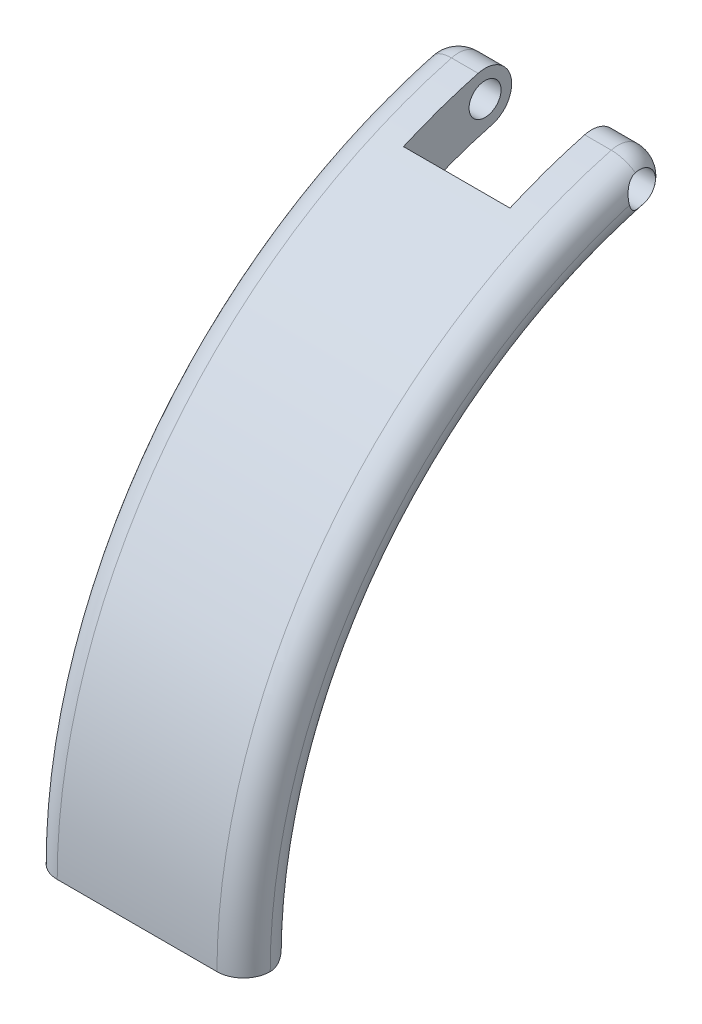
ISO-10303-21;
HEADER;
FILE_DESCRIPTION(('STEP AP214'),'2;1');
FILE_NAME('part.step','',(''),(''),'','','');
FILE_SCHEMA(('AUTOMOTIVE_DESIGN { 1 0 10303 214 1 1 1 1 }'));
ENDSEC;
DATA;
#1=APPLICATION_CONTEXT('core data for automotive mechanical design processes');
#2=APPLICATION_PROTOCOL_DEFINITION('international standard','automotive_design',2000,#1);
#3=PRODUCT_CONTEXT('',#1,'mechanical');
#4=PRODUCT('Part','Part','',(#3));
#5=PRODUCT_RELATED_PRODUCT_CATEGORY('part','',(#4));
#6=PRODUCT_DEFINITION_FORMATION('','',#4);
#7=PRODUCT_DEFINITION_CONTEXT('part definition',#1,'design');
#8=PRODUCT_DEFINITION('design','',#6,#7);
#9=PRODUCT_DEFINITION_SHAPE('','',#8);
#10=(LENGTH_UNIT() NAMED_UNIT(*) SI_UNIT(.MILLI.,.METRE.));
#11=(NAMED_UNIT(*) PLANE_ANGLE_UNIT() SI_UNIT($,.RADIAN.));
#12=(NAMED_UNIT(*) SI_UNIT($,.STERADIAN.) SOLID_ANGLE_UNIT());
#13=UNCERTAINTY_MEASURE_WITH_UNIT(LENGTH_MEASURE(1.E-05),#10,'distance_accuracy_value','');
#14=(GEOMETRIC_REPRESENTATION_CONTEXT(3) GLOBAL_UNCERTAINTY_ASSIGNED_CONTEXT((#13)) GLOBAL_UNIT_ASSIGNED_CONTEXT((#10,
#11,#12)) REPRESENTATION_CONTEXT('',''));
#15=CARTESIAN_POINT('',(0.,0.,0.));
#16=DIRECTION('',(0.,0.,1.));
#17=DIRECTION('',(1.,0.,0.));
#18=AXIS2_PLACEMENT_3D('',#15,#16,#17);
#19=CARTESIAN_POINT('',(5.,41.9292713953123,19.1555788285879));
#20=DIRECTION('',(1.,0.,0.));
#21=DIRECTION('',(0.,0.,-1.));
#22=AXIS2_PLACEMENT_3D('',#19,#20,#21);
#23=PLANE('',#22);
#24=CARTESIAN_POINT('',(5.,0.,0.));
#25=DIRECTION('',(1.,0.,0.));
#26=DIRECTION('',(0.,0.,-1.));
#27=AXIS2_PLACEMENT_3D('',#24,#25,#26);
#28=CIRCLE('',#27,45.);
#29=CARTESIAN_POINT('',(5.,43.4581821155423,11.6784591112167));
#30=VERTEX_POINT('',#29);
#31=CARTESIAN_POINT('',(5.,40.8287821211368,18.9211667321214));
#32=VERTEX_POINT('',#31);
#33=EDGE_CURVE('E147',#30,#32,#28,.T.);
#34=ORIENTED_EDGE('',*,*,#33,.F.);
#35=CARTESIAN_POINT('',(5.,45.8725255664058,12.3272623951732));
#36=DIRECTION('',(1.,0.,0.));
#37=DIRECTION('',(0.,0.,-1.));
#38=AXIS2_PLACEMENT_3D('',#35,#36,#37);
#39=CIRCLE('',#38,2.5);
#40=CARTESIAN_POINT('',(5.,46.3933588997391,9.88211768802618));
#41=VERTEX_POINT('',#40);
#42=EDGE_CURVE('E205',#30,#41,#39,.T.);
#43=ORIENTED_EDGE('',*,*,#42,.T.);
#44=CARTESIAN_POINT('',(5.,45.8725255664058,12.3272623951732));
#45=DIRECTION('',(1.,0.,0.));
#46=DIRECTION('',(0.,0.,-1.));
#47=AXIS2_PLACEMENT_3D('',#44,#45,#46);
#48=CIRCLE('',#47,2.5);
#49=CARTESIAN_POINT('',(5.,48.2868690172692,12.9760656791296));
#50=VERTEX_POINT('',#49);
#51=EDGE_CURVE('E203',#41,#50,#48,.T.);
#52=ORIENTED_EDGE('',*,*,#51,.T.);
#53=CARTESIAN_POINT('',(5.,0.,0.));
#54=DIRECTION('',(1.,0.,0.));
#55=DIRECTION('',(0.,0.,-1.));
#56=AXIS2_PLACEMENT_3D('',#53,#54,#55);
#57=CIRCLE('',#56,50.);
#58=CARTESIAN_POINT('',(5.,45.8315217048835,19.9867860901845));
#59=VERTEX_POINT('',#58);
#60=EDGE_CURVE('E173',#50,#59,#57,.T.);
#61=ORIENTED_EDGE('',*,*,#60,.T.);
#62=DIRECTION('',(0.,-0.978057882858792,-0.208333333333333));
#63=VECTOR('',#62,1.);
#64=CARTESIAN_POINT('',(5.,41.9292713953123,19.1555788285879));
#65=LINE('',#64,#63);
#66=EDGE_CURVE('E158',#59,#32,#65,.T.);
#67=ORIENTED_EDGE('',*,*,#66,.T.);
#68=EDGE_LOOP('',(#34,#43,#52,#61,#67));
#69=FACE_BOUND('',#68,.T.);
#70=CARTESIAN_POINT('',(5.,45.8727505642991,12.3264250967423));
#71=DIRECTION('',(-1.,0.,0.));
#72=DIRECTION('',(0.,0.,1.));
#73=AXIS2_PLACEMENT_3D('',#70,#71,#72);
#74=CIRCLE('',#73,1.5);
#75=CARTESIAN_POINT('',(5.,45.8727505642991,13.8264250967423));
#76=VERTEX_POINT('',#75);
#77=EDGE_CURVE('E159',#76,#76,#74,.T.);
#78=ORIENTED_EDGE('',*,*,#77,.T.);
#79=EDGE_LOOP('',(#78));
#80=FACE_BOUND('',#79,.T.);
#81=ADVANCED_FACE('F36',(#69,#80),#23,.T.);
#82=CARTESIAN_POINT('',(20.,0.,0.));
#83=DIRECTION('',(-1.,0.,0.));
#84=DIRECTION('',(0.,0.,1.));
#85=AXIS2_PLACEMENT_3D('',#82,#83,#84);
#86=CYLINDRICAL_SURFACE('',#85,45.);
#87=DIRECTION('',(-1.,0.,0.));
#88=VECTOR('',#87,1.);
#89=CARTESIAN_POINT('',(20.,43.4581821155423,11.6784591112167));
#90=LINE('',#89,#88);
#91=CARTESIAN_POINT('',(15.,43.4581821155423,11.6784591112167));
#92=VERTEX_POINT('',#91);
#93=CARTESIAN_POINT('',(17.5,43.4581821155423,11.6784591112167));
#94=VERTEX_POINT('',#93);
#95=EDGE_CURVE('E201',#92,#94,#90,.F.);
#96=ORIENTED_EDGE('',*,*,#95,.T.);
#97=CARTESIAN_POINT('',(17.5,0.,0.));
#98=DIRECTION('',(1.,0.,0.));
#99=DIRECTION('',(0.,0.,-1.));
#100=AXIS2_PLACEMENT_3D('',#97,#98,#99);
#101=CIRCLE('',#100,45.);
#102=CARTESIAN_POINT('',(17.5,2.36842105263158,44.9376299076559));
#103=VERTEX_POINT('',#102);
#104=EDGE_CURVE('E11',#94,#103,#101,.T.);
#105=ORIENTED_EDGE('',*,*,#104,.T.);
#106=DIRECTION('',(-1.,0.,0.));
#107=VECTOR('',#106,1.);
#108=CARTESIAN_POINT('',(20.,2.36842105263158,44.9376299076559));
#109=LINE('',#108,#107);
#110=CARTESIAN_POINT('',(2.5,2.36842105263158,44.9376299076559));
#111=VERTEX_POINT('',#110);
#112=EDGE_CURVE('E46',#103,#111,#109,.T.);
#113=ORIENTED_EDGE('',*,*,#112,.T.);
#114=CARTESIAN_POINT('',(2.5,0.,0.));
#115=DIRECTION('',(1.,0.,0.));
#116=DIRECTION('',(0.,0.,-1.));
#117=AXIS2_PLACEMENT_3D('',#114,#115,#116);
#118=CIRCLE('',#117,45.);
#119=CARTESIAN_POINT('',(2.5,43.4581821155423,11.6784591112167));
#120=VERTEX_POINT('',#119);
#121=EDGE_CURVE('E402',#111,#120,#118,.F.);
#122=ORIENTED_EDGE('',*,*,#121,.T.);
#123=DIRECTION('',(-1.,0.,0.));
#124=VECTOR('',#123,1.);
#125=CARTESIAN_POINT('',(20.,43.4581821155423,11.6784591112167));
#126=LINE('',#125,#124);
#127=EDGE_CURVE('E153',#120,#30,#126,.F.);
#128=ORIENTED_EDGE('',*,*,#127,.T.);
#129=ORIENTED_EDGE('',*,*,#33,.T.);
#130=DIRECTION('',(-1.,0.,0.));
#131=VECTOR('',#130,1.);
#132=CARTESIAN_POINT('',(20.,40.8287821211368,18.9211667321214));
#133=LINE('',#132,#131);
#134=CARTESIAN_POINT('',(15.,40.8287821211368,18.9211667321214));
#135=VERTEX_POINT('',#134);
#136=EDGE_CURVE('E151',#135,#32,#133,.T.);
#137=ORIENTED_EDGE('',*,*,#136,.F.);
#138=CARTESIAN_POINT('',(15.,0.,0.));
#139=DIRECTION('',(1.,0.,0.));
#140=DIRECTION('',(0.,0.,-1.));
#141=AXIS2_PLACEMENT_3D('',#138,#139,#140);
#142=CIRCLE('',#141,45.);
#143=EDGE_CURVE('E168',#92,#135,#142,.T.);
#144=ORIENTED_EDGE('',*,*,#143,.F.);
#145=EDGE_LOOP('',(#96,#105,#113,#122,#128,#129,#137,#144));
#146=FACE_BOUND('',#145,.T.);
#147=ADVANCED_FACE('F149',(#146),#86,.F.);
#148=CARTESIAN_POINT('',(20.,0.,0.));
#149=DIRECTION('',(-1.,0.,0.));
#150=DIRECTION('',(0.,0.,1.));
#151=AXIS2_PLACEMENT_3D('',#148,#149,#150);
#152=CYLINDRICAL_SURFACE('',#151,50.);
#153=DIRECTION('',(-1.,0.,0.));
#154=VECTOR('',#153,1.);
#155=CARTESIAN_POINT('',(20.,0.,50.));
#156=LINE('',#155,#154);
#157=CARTESIAN_POINT('',(17.5,0.,50.));
#158=VERTEX_POINT('',#157);
#159=CARTESIAN_POINT('',(2.5,0.,50.));
#160=VERTEX_POINT('',#159);
#161=EDGE_CURVE('E184',#158,#160,#156,.T.);
#162=ORIENTED_EDGE('',*,*,#161,.F.);
#163=CARTESIAN_POINT('',(17.5,0.,0.));
#164=DIRECTION('',(1.,0.,0.));
#165=DIRECTION('',(0.,0.,-1.));
#166=AXIS2_PLACEMENT_3D('',#163,#164,#165);
#167=CIRCLE('',#166,50.);
#168=CARTESIAN_POINT('',(17.5,48.2868690172692,12.9760656791296));
#169=VERTEX_POINT('',#168);
#170=EDGE_CURVE('E223',#158,#169,#167,.F.);
#171=ORIENTED_EDGE('',*,*,#170,.T.);
#172=DIRECTION('',(-1.,0.,0.));
#173=VECTOR('',#172,1.);
#174=CARTESIAN_POINT('',(20.,48.2868690172692,12.9760656791296));
#175=LINE('',#174,#173);
#176=CARTESIAN_POINT('',(15.,48.2868690172692,12.9760656791296));
#177=VERTEX_POINT('',#176);
#178=EDGE_CURVE('E193',#169,#177,#175,.T.);
#179=ORIENTED_EDGE('',*,*,#178,.T.);
#180=CARTESIAN_POINT('',(15.,0.,0.));
#181=DIRECTION('',(1.,0.,0.));
#182=DIRECTION('',(0.,0.,-1.));
#183=AXIS2_PLACEMENT_3D('',#180,#181,#182);
#184=CIRCLE('',#183,50.);
#185=CARTESIAN_POINT('',(15.,45.8315217048835,19.9867860901845));
#186=VERTEX_POINT('',#185);
#187=EDGE_CURVE('E182',#177,#186,#184,.T.);
#188=ORIENTED_EDGE('',*,*,#187,.T.);
#189=DIRECTION('',(-1.,0.,0.));
#190=VECTOR('',#189,1.);
#191=CARTESIAN_POINT('',(20.,45.8315217048835,19.9867860901845));
#192=LINE('',#191,#190);
#193=EDGE_CURVE('E187',#59,#186,#192,.F.);
#194=ORIENTED_EDGE('',*,*,#193,.F.);
#195=ORIENTED_EDGE('',*,*,#60,.F.);
#196=DIRECTION('',(-1.,0.,0.));
#197=VECTOR('',#196,1.);
#198=CARTESIAN_POINT('',(20.,48.2868690172692,12.9760656791296));
#199=LINE('',#198,#197);
#200=CARTESIAN_POINT('',(2.5,48.2868690172692,12.9760656791296));
#201=VERTEX_POINT('',#200);
#202=EDGE_CURVE('E190',#50,#201,#199,.T.);
#203=ORIENTED_EDGE('',*,*,#202,.T.);
#204=CARTESIAN_POINT('',(2.5,0.,0.));
#205=DIRECTION('',(1.,0.,0.));
#206=DIRECTION('',(0.,0.,-1.));
#207=AXIS2_PLACEMENT_3D('',#204,#205,#206);
#208=CIRCLE('',#207,50.);
#209=EDGE_CURVE('E221',#201,#160,#208,.T.);
#210=ORIENTED_EDGE('',*,*,#209,.T.);
#211=EDGE_LOOP('',(#162,#171,#179,#188,#194,#195,#203,#210));
#212=FACE_BOUND('',#211,.T.);
#213=ADVANCED_FACE('F342',(#212),#152,.T.);
#214=CARTESIAN_POINT('',(20.,0.,50.));
#215=DIRECTION('',(0.,1.,0.));
#216=DIRECTION('',(0.,0.,1.));
#217=AXIS2_PLACEMENT_3D('',#214,#215,#216);
#218=PLANE('',#217);
#219=CARTESIAN_POINT('',(17.5,0.,47.5));
#220=DIRECTION('',(0.,1.,0.));
#221=DIRECTION('',(0.,0.,1.));
#222=AXIS2_PLACEMENT_3D('',#219,#220,#221);
#223=CIRCLE('',#222,2.5);
#224=CARTESIAN_POINT('',(19.9991329976495,0.,47.4341649025257));
#225=VERTEX_POINT('',#224);
#226=CARTESIAN_POINT('',(20.,0.,47.5));
#227=VERTEX_POINT('',#226);
#228=EDGE_CURVE('E217',#225,#227,#223,.F.);
#229=ORIENTED_EDGE('',*,*,#228,.T.);
#230=CARTESIAN_POINT('',(17.5,0.,47.5));
#231=DIRECTION('',(0.,1.,0.));
#232=DIRECTION('',(0.,0.,1.));
#233=AXIS2_PLACEMENT_3D('',#230,#231,#232);
#234=CIRCLE('',#233,2.5);
#235=EDGE_CURVE('E219',#227,#158,#234,.F.);
#236=ORIENTED_EDGE('',*,*,#235,.T.);
#237=ORIENTED_EDGE('',*,*,#161,.T.);
#238=CARTESIAN_POINT('',(2.5,0.,47.5));
#239=DIRECTION('',(0.,1.,0.));
#240=DIRECTION('',(0.,0.,1.));
#241=AXIS2_PLACEMENT_3D('',#238,#239,#240);
#242=CIRCLE('',#241,2.5);
#243=CARTESIAN_POINT('',(0.,0.,47.5));
#244=VERTEX_POINT('',#243);
#245=EDGE_CURVE('E215',#160,#244,#242,.F.);
#246=ORIENTED_EDGE('',*,*,#245,.T.);
#247=CARTESIAN_POINT('',(2.5,0.,47.5));
#248=DIRECTION('',(0.,1.,0.));
#249=DIRECTION('',(0.,0.,1.));
#250=AXIS2_PLACEMENT_3D('',#247,#248,#249);
#251=CIRCLE('',#250,2.5);
#252=CARTESIAN_POINT('',(0.000867002350503354,0.,47.4341649025257));
#253=VERTEX_POINT('',#252);
#254=EDGE_CURVE('E207',#244,#253,#251,.F.);
#255=ORIENTED_EDGE('',*,*,#254,.T.);
#256=DIRECTION('',(-1.,0.,0.));
#257=VECTOR('',#256,1.);
#258=CARTESIAN_POINT('',(20.,0.,47.4341649025257));
#259=LINE('',#258,#257);
#260=EDGE_CURVE('E213',#253,#225,#259,.F.);
#261=ORIENTED_EDGE('',*,*,#260,.T.);
#262=EDGE_LOOP('',(#229,#236,#237,#246,#255,#261));
#263=FACE_BOUND('',#262,.T.);
#264=ADVANCED_FACE('F347',(#263),#218,.F.);
#265=CARTESIAN_POINT('',(0.,-2.08333333333333,9.78057882858791));
#266=DIRECTION('',(0.,0.208333333333333,-0.978057882858792));
#267=DIRECTION('',(0.,0.978057882858792,0.208333333333333));
#268=AXIS2_PLACEMENT_3D('',#265,#266,#267);
#269=PLANE('',#268);
#270=ORIENTED_EDGE('',*,*,#193,.T.);
#271=DIRECTION('',(0.,-0.978057882858792,-0.208333333333333));
#272=VECTOR('',#271,1.);
#273=CARTESIAN_POINT('',(15.,41.9292713953123,19.1555788285879));
#274=LINE('',#273,#272);
#275=EDGE_CURVE('E167',#186,#135,#274,.T.);
#276=ORIENTED_EDGE('',*,*,#275,.T.);
#277=ORIENTED_EDGE('',*,*,#136,.T.);
#278=ORIENTED_EDGE('',*,*,#66,.F.);
#279=EDGE_LOOP('',(#270,#276,#277,#278));
#280=FACE_BOUND('',#279,.T.);
#281=ADVANCED_FACE('F165',(#280),#269,.T.);
#282=CARTESIAN_POINT('',(15.,41.9292713953123,19.1555788285879));
#283=DIRECTION('',(1.,0.,0.));
#284=DIRECTION('',(0.,0.,-1.));
#285=AXIS2_PLACEMENT_3D('',#282,#283,#284);
#286=PLANE('',#285);
#287=CARTESIAN_POINT('',(15.,45.8727505642991,12.3264250967423));
#288=DIRECTION('',(-1.,0.,0.));
#289=DIRECTION('',(0.,0.,1.));
#290=AXIS2_PLACEMENT_3D('',#287,#288,#289);
#291=CIRCLE('',#290,1.5);
#292=CARTESIAN_POINT('',(15.,45.8727505642991,13.8264250967423));
#293=VERTEX_POINT('',#292);
#294=EDGE_CURVE('E169',#293,#293,#291,.T.);
#295=ORIENTED_EDGE('',*,*,#294,.F.);
#296=EDGE_LOOP('',(#295));
#297=FACE_BOUND('',#296,.T.);
#298=ORIENTED_EDGE('',*,*,#187,.F.);
#299=CARTESIAN_POINT('',(15.,45.8725255664058,12.3272623951732));
#300=DIRECTION('',(1.,0.,0.));
#301=DIRECTION('',(0.,0.,-1.));
#302=AXIS2_PLACEMENT_3D('',#299,#300,#301);
#303=CIRCLE('',#302,2.5);
#304=CARTESIAN_POINT('',(15.,46.3933588997391,9.88211768802618));
#305=VERTEX_POINT('',#304);
#306=EDGE_CURVE('E197',#177,#305,#303,.F.);
#307=ORIENTED_EDGE('',*,*,#306,.T.);
#308=CARTESIAN_POINT('',(15.,45.8725255664058,12.3272623951732));
#309=DIRECTION('',(1.,0.,0.));
#310=DIRECTION('',(0.,0.,-1.));
#311=AXIS2_PLACEMENT_3D('',#308,#309,#310);
#312=CIRCLE('',#311,2.5);
#313=EDGE_CURVE('E195',#305,#92,#312,.F.);
#314=ORIENTED_EDGE('',*,*,#313,.T.);
#315=ORIENTED_EDGE('',*,*,#143,.T.);
#316=ORIENTED_EDGE('',*,*,#275,.F.);
#317=EDGE_LOOP('',(#298,#307,#314,#315,#316));
#318=FACE_BOUND('',#317,.T.);
#319=ADVANCED_FACE('F249',(#297,#318),#286,.F.);
#320=CARTESIAN_POINT('',(20.001,45.8727505642991,12.3264250967423));
#321=DIRECTION('',(-1.,0.,0.));
#322=DIRECTION('',(0.,0.,1.));
#323=AXIS2_PLACEMENT_3D('',#320,#321,#322);
#324=CYLINDRICAL_SURFACE('',#323,1.5);
#325=CARTESIAN_POINT('',(19.49935035694,46.185205941447,10.8593287681764));
#326=CARTESIAN_POINT('',(19.4993493936338,46.2264827498817,10.8681199977383));
#327=CARTESIAN_POINT('',(19.4993492021619,46.2673686664628,10.8786495525167));
#328=CARTESIAN_POINT('',(19.4993503610981,46.3481068423771,10.9031129415853));
#329=CARTESIAN_POINT('',(19.4993517114321,46.3879591512435,10.9170466124071));
#330=CARTESIAN_POINT('',(19.4993580653417,46.5054626561994,10.9637946004257));
#331=CARTESIAN_POINT('',(19.4993653686237,46.581200138259,11.0015857932504));
#332=CARTESIAN_POINT('',(19.4993859098252,46.7252532403003,11.0893455716204));
#333=CARTESIAN_POINT('',(19.4993991505749,46.7935653013624,11.139319959547));
#334=CARTESIAN_POINT('',(19.4994311894941,46.9208304776906,11.2500254610628));
#335=CARTESIAN_POINT('',(19.499449986849,46.979784962848,11.3107549974057));
#336=CARTESIAN_POINT('',(19.499492605998,47.0866608606094,11.4412491414251));
#337=CARTESIAN_POINT('',(19.4995164279151,47.1345820027872,11.5110139704904));
#338=CARTESIAN_POINT('',(19.4995684222967,47.2180370491895,11.6576070852024));
#339=CARTESIAN_POINT('',(19.4995965951856,47.2535697438821,11.734436059624));
#340=CARTESIAN_POINT('',(19.49965648938,47.311233528569,11.8929701217883));
#341=CARTESIAN_POINT('',(19.4996882109277,47.3333637032409,11.9746755421484));
#342=CARTESIAN_POINT('',(19.4997543005447,47.3635871552962,12.1406390774463));
#343=CARTESIAN_POINT('',(19.4997886679931,47.3716837158511,12.224896590626));
#344=CARTESIAN_POINT('',(19.499852523146,47.3734402415033,12.3778818054195));
#345=CARTESIAN_POINT('',(19.4998817341027,47.3694986425181,12.4465922684488));
#346=CARTESIAN_POINT('',(19.4999406918449,47.3522796098555,12.5827874184328));
#347=CARTESIAN_POINT('',(19.4999704382737,47.3390081800681,12.6502728650704));
#348=CARTESIAN_POINT('',(19.5000001938576,47.3211313873031,12.7165442984668));
#349=B_SPLINE_CURVE_WITH_KNOTS('',3,(#325,#326,#327,#328,#329,#330,#331,#332,#333,#334,#335,
#336,#337,#338,#339,#340,#341,#342,#343,#344,#345,#346,#347,#348),.UNSPECIFIED.,.F.,.F.,(4,2,2,
2,2,2,2,2,2,2,2,4),(0.,0.126530076023759,0.253054077168638,0.505678920931936,0.758424315925027,
1.01113267636044,1.26384722999467,1.51658645022048,1.76934292927145,2.0220402678219,
2.22788319944891,2.43359378908585),.UNSPECIFIED.);
#350=CARTESIAN_POINT('',(19.49935035694,46.185205941447,10.8593287681764));
#351=VERTEX_POINT('',#350);
#352=CARTESIAN_POINT('',(19.5000001938576,47.3211313873031,12.7165442984668));
#353=VERTEX_POINT('',#352);
#354=EDGE_CURVE('E257',#351,#353,#349,.T.);
#355=ORIENTED_EDGE('',*,*,#354,.T.);
#356=CARTESIAN_POINT('',(19.5000001938576,47.3211313873031,12.7165442984668));
#357=CARTESIAN_POINT('',(19.5000059780242,47.3112287332248,12.7533257728187));
#358=CARTESIAN_POINT('',(19.501089338204,47.29992234124,12.7897039518504));
#359=CARTESIAN_POINT('',(19.5053087588972,47.2746366037146,12.8613605854016));
#360=CARTESIAN_POINT('',(19.5084429488599,47.2606597021481,12.8966400113989));
#361=CARTESIAN_POINT('',(19.5207010535486,47.215154977161,12.9998978567853));
#362=CARTESIAN_POINT('',(19.5326843571568,47.17987900991,13.0659341175434));
#363=CARTESIAN_POINT('',(19.5625224527295,47.1008709045788,13.1908217864053));
#364=CARTESIAN_POINT('',(19.5803582732416,47.0571662750202,13.2496955780073));
#365=CARTESIAN_POINT('',(19.6198857036813,46.9623753892477,13.3598711686711));
#366=CARTESIAN_POINT('',(19.6415856558672,46.9112732080564,13.4111561366492));
#367=CARTESIAN_POINT('',(19.6894493447894,46.7964808617001,13.5109742039205));
#368=CARTESIAN_POINT('',(19.7158393580067,46.732018784839,13.5585104848771));
#369=CARTESIAN_POINT('',(19.7684654508942,46.5963076459067,13.6428027877274));
#370=CARTESIAN_POINT('',(19.7947014503585,46.5250553320228,13.6795536097983));
#371=CARTESIAN_POINT('',(19.8474809930048,46.3688286213237,13.7448107042366));
#372=CARTESIAN_POINT('',(19.8737526421134,46.28320304572,13.7720006462676));
#373=CARTESIAN_POINT('',(19.920439768967,46.1070695898582,13.8107420007786));
#374=CARTESIAN_POINT('',(19.9408674312423,46.0165723422642,13.8223261408245));
#375=CARTESIAN_POINT('',(19.9708673692487,45.8477708837703,13.8282040456232));
#376=CARTESIAN_POINT('',(19.9816376594759,45.7697730149698,13.824918397412));
#377=CARTESIAN_POINT('',(19.9925708124687,45.6532335226581,13.8107979240044));
#378=CARTESIAN_POINT('',(19.9953452381098,45.6143362652467,13.8045231980774));
#379=CARTESIAN_POINT('',(19.9990631228207,45.5370458052204,13.7889090036888));
#380=CARTESIAN_POINT('',(20.000005323098,45.4986529671308,13.7795674333619));
#381=CARTESIAN_POINT('',(20.,45.4606707204937,13.7687115462138));
#382=B_SPLINE_CURVE_WITH_KNOTS('',3,(#356,#357,#358,#359,#360,#361,#362,#363,#364,#365,#366,
#367,#368,#369,#370,#371,#372,#373,#374,#375,#376,#377,#378,#379,#380,#381),.UNSPECIFIED.,.F.,
.F.,(4,2,2,2,2,2,2,2,2,2,2,2,4),(0.,0.114186326495628,0.228268649168263,0.454478793891325,
0.679962785133128,0.905939608748188,1.15793652259836,1.41005472890361,1.68935895648066,
1.96807652713247,2.20320814480767,2.32155384849757,2.43998083046461),.UNSPECIFIED.);
#383=CARTESIAN_POINT('',(20.,45.4606707204938,13.7687115462138));
#384=VERTEX_POINT('',#383);
#385=EDGE_CURVE('E262',#353,#384,#382,.T.);
#386=ORIENTED_EDGE('',*,*,#385,.T.);
#387=CARTESIAN_POINT('',(20.,45.4606707204938,13.7687115462138));
#388=CARTESIAN_POINT('',(20.0000078066762,45.4236454332307,13.7581402421578));
#389=CARTESIAN_POINT('',(19.9991108825217,45.3870359162294,13.7461314084336));
#390=CARTESIAN_POINT('',(19.9955596641298,45.3149381199744,13.71937788513));
#391=CARTESIAN_POINT('',(19.99290623247,45.2794492993318,13.7046345409583));
#392=CARTESIAN_POINT('',(19.9859134252343,45.2100385633165,13.6726294828424));
#393=CARTESIAN_POINT('',(19.9815834731626,45.1761090551721,13.6553821761917));
#394=CARTESIAN_POINT('',(19.9713432565247,45.1098427220384,13.6184822658577));
#395=CARTESIAN_POINT('',(19.96543286861,45.0775060215968,13.598829474498));
#396=CARTESIAN_POINT('',(19.9455408897634,44.9832908694315,13.5365935931406));
#397=CARTESIAN_POINT('',(19.9293802162087,44.9240356537586,13.4906530687377));
#398=CARTESIAN_POINT('',(19.8925971158397,44.8137310439286,13.3913230737351));
#399=CARTESIAN_POINT('',(19.8719697180711,44.762690903434,13.3379253277992));
#400=CARTESIAN_POINT('',(19.8261714575865,44.6659243989394,13.2207239708013));
#401=CARTESIAN_POINT('',(19.8007753914747,44.6208879237309,13.1564395028411));
#402=CARTESIAN_POINT('',(19.7487620327895,44.5414518112429,13.0219523146778));
#403=CARTESIAN_POINT('',(19.722142949784,44.5070683786193,12.951740783054));
#404=CARTESIAN_POINT('',(19.6667233628786,44.4457854266714,12.7971119190749));
#405=CARTESIAN_POINT('',(19.6380799332746,44.4204077807989,12.7120267275758));
#406=CARTESIAN_POINT('',(19.5862641850443,44.3849959713363,12.5373363681589));
#407=CARTESIAN_POINT('',(19.5630723579182,44.3749063709968,12.4477487541008));
#408=CARTESIAN_POINT('',(19.5306395920456,44.3716512053057,12.2875668508179));
#409=CARTESIAN_POINT('',(19.519400074078,44.3750621325695,12.2174633648902));
#410=CARTESIAN_POINT('',(19.5079092109396,44.3876742003409,12.1123934530894));
#411=CARTESIAN_POINT('',(19.5049728240423,44.3931647814099,12.0772436408079));
#412=CARTESIAN_POINT('',(19.5010199043889,44.4066598769056,12.0072843390007));
#413=CARTESIAN_POINT('',(19.500005336764,44.4146669548026,11.9724752339925));
#414=CARTESIAN_POINT('',(19.5000001819887,44.4239197302255,11.9379804877726));
#415=B_SPLINE_CURVE_WITH_KNOTS('',3,(#387,#388,#389,#390,#391,#392,#393,#394,#395,#396,#397,
#398,#399,#400,#401,#402,#403,#404,#405,#406,#407,#408,#409,#410,#411,#412,#413,#414),
.UNSPECIFIED.,.F.,.F.,(4,2,2,2,2,2,2,2,2,2,2,2,2,4),(0.,0.115467281896878,0.230877902671698,
0.345649018294493,0.460429094101107,0.689425687787682,0.918678450427434,1.16520028018197,
1.41209528107701,1.69060185226975,1.96809607941732,2.18029811025743,2.28726017073712,
2.39433154495708),.UNSPECIFIED.);
#416=CARTESIAN_POINT('',(19.5000001819887,44.4239197302255,11.9379804877726));
#417=VERTEX_POINT('',#416);
#418=EDGE_CURVE('E226',#384,#417,#415,.T.);
#419=ORIENTED_EDGE('',*,*,#418,.T.);
#420=CARTESIAN_POINT('',(19.5000001819887,44.4239197302255,11.9379804877726));
#421=CARTESIAN_POINT('',(19.4999818877341,44.4348486498216,11.897218605433));
#422=CARTESIAN_POINT('',(19.4999636014084,44.4474930877712,11.8569376014237));
#423=CARTESIAN_POINT('',(19.4999271581301,44.476127622786,11.7775850877187));
#424=CARTESIAN_POINT('',(19.4999090011712,44.4921175595266,11.7385135201667));
#425=CARTESIAN_POINT('',(19.4998549504978,44.5449222036026,11.6236031755888));
#426=CARTESIAN_POINT('',(19.4998194168895,44.5866077777222,11.5499348920407));
#427=CARTESIAN_POINT('',(19.4997503917523,44.6817541110181,11.4106442836592));
#428=CARTESIAN_POINT('',(19.4997169012204,44.7352205610526,11.3450258713187));
#429=CARTESIAN_POINT('',(19.499652915047,44.8524051404344,11.2237001312314));
#430=CARTESIAN_POINT('',(19.4996224187779,44.9161211137248,11.1679907242364));
#431=CARTESIAN_POINT('',(19.4995652870726,45.0519951249645,11.0680634594576));
#432=CARTESIAN_POINT('',(19.4995386514467,45.1241527478468,11.0238450370183));
#433=CARTESIAN_POINT('',(19.4994899859671,45.274893409934,10.9481360789142));
#434=CARTESIAN_POINT('',(19.4994679575361,45.3534784235813,10.9166494721493));
#435=CARTESIAN_POINT('',(19.4994291376545,45.5148357893848,10.8673084056711));
#436=CARTESIAN_POINT('',(19.4994123479989,45.5976095654634,10.8494586152842));
#437=CARTESIAN_POINT('',(19.4993845040052,45.7649390844198,10.8279340628495));
#438=CARTESIAN_POINT('',(19.4993734439907,45.8494929769546,10.8242452481869));
#439=CARTESIAN_POINT('',(19.499361358827,45.9759955336039,10.8293809987433));
#440=CARTESIAN_POINT('',(19.4993580785606,46.0182210206413,10.8328949387599));
#441=CARTESIAN_POINT('',(19.4993530616905,46.1021500499143,10.8434686448541));
#442=CARTESIAN_POINT('',(19.4993513223742,46.143854381406,10.8505221457473));
#443=CARTESIAN_POINT('',(19.49935035694,46.185205941447,10.8593287681764));
#444=B_SPLINE_CURVE_WITH_KNOTS('',3,(#420,#421,#422,#423,#424,#425,#426,#427,#428,#429,#430,
#431,#432,#433,#434,#435,#436,#437,#438,#439,#440,#441,#442,#443),.UNSPECIFIED.,.F.,.F.,(4,2,2,
2,2,2,2,2,2,2,2,4),(0.,0.126526951616191,0.253047841132053,0.50567902558374,0.758432514393435,
1.01113290415108,1.26382087411641,1.5165867614432,1.76943915855779,2.02204057316084,
2.14902352863055,2.27578250712219),.UNSPECIFIED.);
#445=EDGE_CURVE('E233',#417,#351,#444,.T.);
#446=ORIENTED_EDGE('',*,*,#445,.T.);
#447=EDGE_LOOP('',(#355,#386,#419,#446));
#448=FACE_BOUND('',#447,.T.);
#449=ORIENTED_EDGE('',*,*,#294,.T.);
#450=EDGE_LOOP('',(#449));
#451=FACE_BOUND('',#450,.T.);
#452=ADVANCED_FACE('F243',(#448,#451),#324,.F.);
#453=CARTESIAN_POINT('',(-0.00100000000000013,45.8727505642991,12.3264250967423));
#454=DIRECTION('',(1.,0.,0.));
#455=DIRECTION('',(0.,0.,-1.));
#456=AXIS2_PLACEMENT_3D('',#453,#454,#455);
#457=CYLINDRICAL_SURFACE('',#456,1.5);
#458=ORIENTED_EDGE('',*,*,#77,.F.);
#459=EDGE_LOOP('',(#458));
#460=FACE_BOUND('',#459,.T.);
#461=CARTESIAN_POINT('',(0.499999818011255,44.4239197302255,11.9379804877726));
#462=CARTESIAN_POINT('',(0.499995908758174,44.4141204705412,11.9745117416278));
#463=CARTESIAN_POINT('',(0.498857831938684,44.405719501544,12.011391729852));
#464=CARTESIAN_POINT('',(0.494430864296597,44.3917434632787,12.085516927936));
#465=CARTESIAN_POINT('',(0.491144234827857,44.3861654338029,12.1227617132941));
#466=CARTESIAN_POINT('',(0.478313660919641,44.3737604889844,12.2339691910044));
#467=CARTESIAN_POINT('',(0.46579429371892,44.3710804865771,12.3080942489456));
#468=CARTESIAN_POINT('',(0.434778037051715,44.376420224108,12.4542704148919));
#469=CARTESIAN_POINT('',(0.416303733474266,44.3843998880307,12.526328256357));
#470=CARTESIAN_POINT('',(0.375551758731595,44.410311034102,12.6676662708591));
#471=CARTESIAN_POINT('',(0.353264810970374,44.4282670351748,12.7369391476682));
#472=CARTESIAN_POINT('',(0.304032026309034,44.4764847193425,12.880393678489));
#473=CARTESIAN_POINT('',(0.276855325494502,44.5080297118882,12.954064731434));
#474=CARTESIAN_POINT('',(0.222998103502583,44.582509375774,13.0956306797395));
#475=CARTESIAN_POINT('',(0.196317779668907,44.6254484777022,13.163523314575));
#476=CARTESIAN_POINT('',(0.143080111033435,44.7275320103053,13.2992771413779));
#477=CARTESIAN_POINT('',(0.11684962360853,44.7879285607894,13.3663371042523));
#478=CARTESIAN_POINT('',(0.0709313605690543,44.9210752987723,13.489392795939));
#479=CARTESIAN_POINT('',(0.0512291059642771,44.9937975996266,13.5454128966506));
#480=CARTESIAN_POINT('',(0.0243387066403441,45.1313048150754,13.6322691992043));
#481=CARTESIAN_POINT('',(0.0152982867864755,45.1939428218598,13.6659300761033));
#482=CARTESIAN_POINT('',(0.00616529216500204,45.2914646349262,13.709677808189));
#483=CARTESIAN_POINT('',(0.0038587213393324,45.324655481791,13.7231622145179));
#484=CARTESIAN_POINT('',(0.000773662493191906,45.3919974889626,13.7477496301761));
#485=CARTESIAN_POINT('',(-3.97671047794416E-06,45.426149172032,13.7588513136446));
#486=CARTESIAN_POINT('',(0.,45.4606707204938,13.7687115462138));
#487=B_SPLINE_CURVE_WITH_KNOTS('',3,(#461,#462,#463,#464,#465,#466,#467,#468,#469,#470,#471,
#472,#473,#474,#475,#476,#477,#478,#479,#480,#481,#482,#483,#484,#485,#486),.UNSPECIFIED.,.F.,
.F.,(4,2,2,2,2,2,2,2,2,2,2,2,4),(0.,0.113378457332045,0.226637775430082,0.451051107413229,
0.674623106483505,0.898747026527683,1.15162785660177,1.40460716359959,1.68501018563221,
1.96478707175212,2.17885793795379,2.28644479898995,2.39409137216526),.UNSPECIFIED.);
#488=CARTESIAN_POINT('',(0.499999818011255,44.4239197302255,11.9379804877726));
#489=VERTEX_POINT('',#488);
#490=CARTESIAN_POINT('',(0.,45.4606707204938,13.7687115462138));
#491=VERTEX_POINT('',#490);
#492=EDGE_CURVE('E291',#489,#491,#487,.T.);
#493=ORIENTED_EDGE('',*,*,#492,.T.);
#494=CARTESIAN_POINT('',(0.,45.4606707204937,13.7687115462138));
#495=CARTESIAN_POINT('',(-4.42619903604343E-06,45.4978297291847,13.7793312541371));
#496=CARTESIAN_POINT('',(0.00089683619768629,45.5353801550791,13.7885025600358));
#497=CARTESIAN_POINT('',(0.00445577855857993,45.6109767348366,13.8039098767363));
#498=CARTESIAN_POINT('',(0.0071125503847797,45.6490226224235,13.8101474023497));
#499=CARTESIAN_POINT('',(0.0175906504513263,45.7630467217568,13.8243554465738));
#500=CARTESIAN_POINT('',(0.0279212273194097,45.8393900469894,13.8279569042415));
#501=CARTESIAN_POINT('',(0.0542638230992477,45.9905494057298,13.8237047429558));
#502=CARTESIAN_POINT('',(0.0702666718995048,46.0653676994383,13.8158695497551));
#503=CARTESIAN_POINT('',(0.106598932029727,46.2120502930728,13.7894481641989));
#504=CARTESIAN_POINT('',(0.126933358026318,46.2839110530113,13.7708494677207));
#505=CARTESIAN_POINT('',(0.172020345457934,46.428654146975,13.7218631994755));
#506=CARTESIAN_POINT('',(0.196991033672414,46.5012005387977,13.6906884460845));
#507=CARTESIAN_POINT('',(0.248105443711885,46.6402958945585,13.6175707787028));
#508=CARTESIAN_POINT('',(0.274250638614604,46.7068369931785,13.5756140119912));
#509=CARTESIAN_POINT('',(0.328526816969638,46.8403639370976,13.4759790596509));
#510=CARTESIAN_POINT('',(0.356522890405691,46.9064568717664,13.417022856728));
#511=CARTESIAN_POINT('',(0.407577570184192,47.027967928837,13.2873178737708));
#512=CARTESIAN_POINT('',(0.430651179584336,47.0834184346382,13.2166061304061));
#513=CARTESIAN_POINT('',(0.45730392911174,47.1531733235102,13.108717403762));
#514=CARTESIAN_POINT('',(0.464448728990229,47.1727554550032,13.0757380778593));
#515=CARTESIAN_POINT('',(0.47694009055163,47.2094573712381,13.0081087700964));
#516=CARTESIAN_POINT('',(0.482287247100154,47.2265779694608,12.9734593452439));
#517=CARTESIAN_POINT('',(0.490993671377385,47.2582937909907,12.9024397483391));
#518=CARTESIAN_POINT('',(0.494336554678652,47.2728675277418,12.8660579497957));
#519=CARTESIAN_POINT('',(0.498840860594331,47.2991765127525,12.7921057202011));
#520=CARTESIAN_POINT('',(0.499999792797549,47.3109085072425,12.754533981794));
#521=CARTESIAN_POINT('',(0.499999806142413,47.3211313873031,12.7165442984668));
#522=B_SPLINE_CURVE_WITH_KNOTS('',3,(#494,#495,#496,#497,#498,#499,#500,#501,#502,#503,#504,
#505,#506,#507,#508,#509,#510,#511,#512,#513,#514,#515,#516,#517,#518,#519,#520,#521),
.UNSPECIFIED.,.F.,.F.,(4,2,2,2,2,2,2,2,2,2,2,2,2,4),(0.,0.115859477416863,0.231659066745047,
0.461787004325877,0.691544588471227,0.921569622766468,1.16904200133409,1.41683393583695,
1.69417015570167,1.97064861535233,2.0875689605515,2.20445057698264,2.32227508610047,
2.44023387218575),.UNSPECIFIED.);
#523=CARTESIAN_POINT('',(0.499999806142415,47.3211313873031,12.7165442984668));
#524=VERTEX_POINT('',#523);
#525=EDGE_CURVE('E315',#491,#524,#522,.T.);
#526=ORIENTED_EDGE('',*,*,#525,.T.);
#527=CARTESIAN_POINT('',(0.499999806142415,47.3211313873031,12.7165442984668));
#528=CARTESIAN_POINT('',(0.500018100852944,47.3321071519966,12.6757939152435));
#529=CARTESIAN_POINT('',(0.500036387648743,47.3413573504848,12.634599691886));
#530=CARTESIAN_POINT('',(0.500072831883874,47.3563563110131,12.5515807561427));
#531=CARTESIAN_POINT('',(0.500090989329374,47.3621052411394,12.5097560741223));
#532=CARTESIAN_POINT('',(0.500145039684094,47.37401272643,12.3838566512353));
#533=CARTESIAN_POINT('',(0.500180572546994,47.3748689966061,12.2992185421382));
#534=CARTESIAN_POINT('',(0.500249596165352,47.3623601117063,12.1310025731476));
#535=CARTESIAN_POINT('',(0.500283085938232,47.3489881700241,12.0474252384746));
#536=CARTESIAN_POINT('',(0.500347072940099,47.3084052218578,11.8837023985906));
#537=CARTESIAN_POINT('',(0.500377570606865,47.2811962435057,11.8035563923066));
#538=CARTESIAN_POINT('',(0.500434707096207,47.2137093128113,11.6489708059273));
#539=CARTESIAN_POINT('',(0.500461345824495,47.1734310412144,11.5745313652862));
#540=CARTESIAN_POINT('',(0.500510011298152,47.0809438797244,11.4334625141157));
#541=CARTESIAN_POINT('',(0.50053203759311,47.0287338257137,11.3668338666023));
#542=CARTESIAN_POINT('',(0.500570849298182,46.9138682961902,11.2432859909244));
#543=CARTESIAN_POINT('',(0.500587634351225,46.8512121094545,11.1863674244032));
#544=CARTESIAN_POINT('',(0.50061548339186,46.7172333052939,11.0838635944866));
#545=CARTESIAN_POINT('',(0.500626548717176,46.645912719112,11.0382756823876));
#546=CARTESIAN_POINT('',(0.500641150613787,46.5105207041759,10.9670257653371));
#547=CARTESIAN_POINT('',(0.5006457027266,46.4475571358522,10.9392364442456));
#548=CARTESIAN_POINT('',(0.500650736839305,46.3184686645201,10.8925271906224));
#549=CARTESIAN_POINT('',(0.500651221454103,46.2523458200476,10.8736015672025));
#550=CARTESIAN_POINT('',(0.500649643059959,46.185205941447,10.8593287681764));
#551=B_SPLINE_CURVE_WITH_KNOTS('',3,(#527,#528,#529,#530,#531,#532,#533,#534,#535,#536,#537,
#538,#539,#540,#541,#542,#543,#544,#545,#546,#547,#548,#549,#550),.UNSPECIFIED.,.F.,.F.,(4,2,2,
2,2,2,2,2,2,2,2,4),(0.,0.126530106060487,0.253054137282074,0.50567904236117,0.758424499106993,
1.01113292093993,1.26384751636011,1.51658677827282,1.7693432549224,2.02204059041365,
2.22788336062309,2.43359378882234),.UNSPECIFIED.);
#552=CARTESIAN_POINT('',(0.500649643059959,46.185205941447,10.8593287681764));
#553=VERTEX_POINT('',#552);
#554=EDGE_CURVE('E311',#524,#553,#551,.T.);
#555=ORIENTED_EDGE('',*,*,#554,.T.);
#556=CARTESIAN_POINT('',(0.500649643059959,46.185205941447,10.8593287681764));
#557=CARTESIAN_POINT('',(0.500648679208937,46.1439300445662,10.8505383067495));
#558=CARTESIAN_POINT('',(0.50064694448643,46.1023028241645,10.8434945042378));
#559=CARTESIAN_POINT('',(0.500641947034563,46.0186052127674,10.832936758216));
#560=CARTESIAN_POINT('',(0.500638684378416,45.9765348431009,10.8294226455997));
#561=CARTESIAN_POINT('',(0.500626637906923,45.8501790208311,10.8242342527646));
#562=CARTESIAN_POINT('',(0.500615592364125,45.7656132374512,10.8278851752201));
#563=CARTESIAN_POINT('',(0.500587782120463,45.5982970743624,10.8493325712335));
#564=CARTESIAN_POINT('',(0.500571014653427,45.5155475933468,10.8671358920817));
#565=CARTESIAN_POINT('',(0.500532239101761,45.3542178107086,10.9163786739574));
#566=CARTESIAN_POINT('',(0.500510232118823,45.2756366368738,10.947815269509));
#567=CARTESIAN_POINT('',(0.50046160313137,45.1248737043811,11.0234309670539));
#568=CARTESIAN_POINT('',(0.500434981353319,45.0526916319583,11.0676094438266));
#569=CARTESIAN_POINT('',(0.500377867456931,44.9167447116906,11.1674744501416));
#570=CARTESIAN_POINT('',(0.500347374147687,44.8529824661966,11.2231645240413));
#571=CARTESIAN_POINT('',(0.500283385211844,44.7356978256888,11.3444701213147));
#572=CARTESIAN_POINT('',(0.500249888560731,44.682178944602,11.4100890369477));
#573=CARTESIAN_POINT('',(0.500180864652896,44.5869578152886,11.5493564382233));
#574=CARTESIAN_POINT('',(0.50014533944476,44.5452438905778,11.6229968890465));
#575=CARTESIAN_POINT('',(0.500091231405597,44.4923256406776,11.7380140253295));
#576=CARTESIAN_POINT('',(0.500073008747153,44.4762650336613,11.777223719429));
#577=CARTESIAN_POINT('',(0.500036465922879,44.4475395087768,11.8567896923412));
#578=CARTESIAN_POINT('',(0.500018145985729,44.4348686514381,11.8971438267815));
#579=CARTESIAN_POINT('',(0.499999818011249,44.4239197302255,11.9379804877726));
#580=B_SPLINE_CURVE_WITH_KNOTS('',3,(#556,#557,#558,#559,#560,#561,#562,#563,#564,#565,#566,
#567,#568,#569,#570,#571,#572,#573,#574,#575,#576,#577,#578,#579),.UNSPECIFIED.,.F.,.F.,(4,2,2,
2,2,2,2,2,2,2,2,4),(0.,0.126526923412641,0.253047784673289,0.505678911297366,0.758432341733022,
1.01113267354509,1.26382060792622,1.51658645972935,1.7694388665982,2.02204029164713,
2.14902338832682,2.27578250772253),.UNSPECIFIED.);
#581=EDGE_CURVE('E297',#553,#489,#580,.T.);
#582=ORIENTED_EDGE('',*,*,#581,.T.);
#583=EDGE_LOOP('',(#493,#526,#555,#582));
#584=FACE_BOUND('',#583,.T.);
#585=ADVANCED_FACE('F248',(#460,#584),#457,.F.);
#586=CARTESIAN_POINT('',(20.,45.8725255664058,12.3272623951732));
#587=DIRECTION('',(-1.,0.,0.));
#588=DIRECTION('',(0.,0.,1.));
#589=AXIS2_PLACEMENT_3D('',#586,#587,#588);
#590=CYLINDRICAL_SURFACE('',#589,2.5);
#591=DIRECTION('',(-1.,0.,0.));
#592=VECTOR('',#591,1.);
#593=CARTESIAN_POINT('',(0.,46.3933588997391,9.88211768802618));
#594=LINE('',#593,#592);
#595=CARTESIAN_POINT('',(17.5,46.3933588997391,9.88211768802618));
#596=VERTEX_POINT('',#595);
#597=EDGE_CURVE('E208',#596,#305,#594,.T.);
#598=ORIENTED_EDGE('',*,*,#597,.F.);
#599=CARTESIAN_POINT('',(17.5,45.8725255664058,12.3272623951732));
#600=DIRECTION('',(-1.,0.,0.));
#601=DIRECTION('',(0.,0.,1.));
#602=AXIS2_PLACEMENT_3D('',#599,#600,#601);
#603=CIRCLE('',#602,2.5);
#604=EDGE_CURVE('E298',#596,#94,#603,.T.);
#605=ORIENTED_EDGE('',*,*,#604,.T.);
#606=ORIENTED_EDGE('',*,*,#95,.F.);
#607=ORIENTED_EDGE('',*,*,#313,.F.);
#608=EDGE_LOOP('',(#598,#605,#606,#607));
#609=FACE_BOUND('',#608,.T.);
#610=ADVANCED_FACE('F305',(#609),#590,.T.);
#611=CARTESIAN_POINT('',(20.,45.8725255664058,12.3272623951732));
#612=DIRECTION('',(-1.,0.,0.));
#613=DIRECTION('',(0.,0.,1.));
#614=AXIS2_PLACEMENT_3D('',#611,#612,#613);
#615=CYLINDRICAL_SURFACE('',#614,2.5);
#616=ORIENTED_EDGE('',*,*,#178,.F.);
#617=CARTESIAN_POINT('',(17.5,45.8725255664058,12.3272623951732));
#618=DIRECTION('',(-1.,0.,0.));
#619=DIRECTION('',(0.,0.,1.));
#620=AXIS2_PLACEMENT_3D('',#617,#618,#619);
#621=CIRCLE('',#620,2.5);
#622=EDGE_CURVE('E385',#169,#596,#621,.T.);
#623=ORIENTED_EDGE('',*,*,#622,.T.);
#624=ORIENTED_EDGE('',*,*,#597,.T.);
#625=ORIENTED_EDGE('',*,*,#306,.F.);
#626=EDGE_LOOP('',(#616,#623,#624,#625));
#627=FACE_BOUND('',#626,.T.);
#628=ADVANCED_FACE('F352',(#627),#615,.T.);
#629=CARTESIAN_POINT('',(20.,45.8725255664058,12.3272623951732));
#630=DIRECTION('',(-1.,0.,0.));
#631=DIRECTION('',(0.,0.,1.));
#632=AXIS2_PLACEMENT_3D('',#629,#630,#631);
#633=CYLINDRICAL_SURFACE('',#632,2.5);
#634=DIRECTION('',(-1.,0.,0.));
#635=VECTOR('',#634,1.);
#636=CARTESIAN_POINT('',(0.,46.3933588997391,9.88211768802618));
#637=LINE('',#636,#635);
#638=CARTESIAN_POINT('',(2.5,46.3933588997391,9.88211768802618));
#639=VERTEX_POINT('',#638);
#640=EDGE_CURVE('E210',#639,#41,#637,.F.);
#641=ORIENTED_EDGE('',*,*,#640,.F.);
#642=CARTESIAN_POINT('',(2.5,45.8725255664058,12.3272623951732));
#643=DIRECTION('',(-1.,0.,0.));
#644=DIRECTION('',(0.,0.,1.));
#645=AXIS2_PLACEMENT_3D('',#642,#643,#644);
#646=CIRCLE('',#645,2.5);
#647=EDGE_CURVE('E321',#639,#201,#646,.F.);
#648=ORIENTED_EDGE('',*,*,#647,.T.);
#649=ORIENTED_EDGE('',*,*,#202,.F.);
#650=ORIENTED_EDGE('',*,*,#51,.F.);
#651=EDGE_LOOP('',(#641,#648,#649,#650));
#652=FACE_BOUND('',#651,.T.);
#653=ADVANCED_FACE('F355',(#652),#633,.T.);
#654=CARTESIAN_POINT('',(20.,45.8725255664058,12.3272623951732));
#655=DIRECTION('',(-1.,0.,0.));
#656=DIRECTION('',(0.,0.,1.));
#657=AXIS2_PLACEMENT_3D('',#654,#655,#656);
#658=CYLINDRICAL_SURFACE('',#657,2.5);
#659=ORIENTED_EDGE('',*,*,#127,.F.);
#660=CARTESIAN_POINT('',(2.5,45.8725255664058,12.3272623951732));
#661=DIRECTION('',(-1.,0.,0.));
#662=DIRECTION('',(0.,0.,1.));
#663=AXIS2_PLACEMENT_3D('',#660,#661,#662);
#664=CIRCLE('',#663,2.5);
#665=EDGE_CURVE('E401',#120,#639,#664,.F.);
#666=ORIENTED_EDGE('',*,*,#665,.T.);
#667=ORIENTED_EDGE('',*,*,#640,.T.);
#668=ORIENTED_EDGE('',*,*,#42,.F.);
#669=EDGE_LOOP('',(#659,#666,#667,#668));
#670=FACE_BOUND('',#669,.T.);
#671=ADVANCED_FACE('F333',(#670),#658,.T.);
#672=CARTESIAN_POINT('',(2.5,45.8725255664058,12.3272623951732));
#673=DIRECTION('',(0.,0.,1.));
#674=DIRECTION('',(1.,0.,0.));
#675=AXIS2_PLACEMENT_3D('',#672,#673,#674);
#676=SPHERICAL_SURFACE('',#675,2.5);
#677=CARTESIAN_POINT('',(2.5,45.8725255664058,12.3272623951732));
#678=DIRECTION('',(0.,-0.259521313582593,0.965737380345384));
#679=DIRECTION('',(0.,-0.965737380345384,-0.259521313582593));
#680=AXIS2_PLACEMENT_3D('',#677,#678,#679);
#681=CIRCLE('',#680,2.5);
#682=EDGE_CURVE('E426',#201,#524,#681,.T.);
#683=ORIENTED_EDGE('',*,*,#682,.F.);
#684=ORIENTED_EDGE('',*,*,#647,.F.);
#685=CARTESIAN_POINT('',(2.5,45.8725255664058,12.3272623951732));
#686=DIRECTION('',(0.,-0.978057882858792,-0.208333333333333));
#687=DIRECTION('',(0.,0.208333333333333,-0.978057882858792));
#688=AXIS2_PLACEMENT_3D('',#685,#686,#687);
#689=CIRCLE('',#688,2.5);
#690=EDGE_CURVE('E41',#553,#639,#689,.T.);
#691=ORIENTED_EDGE('',*,*,#690,.F.);
#692=ORIENTED_EDGE('',*,*,#554,.F.);
#693=EDGE_LOOP('',(#683,#684,#691,#692));
#694=FACE_BOUND('',#693,.T.);
#695=ADVANCED_FACE('F38',(#694),#676,.T.);
#696=CARTESIAN_POINT('',(2.5,45.8725255664058,12.3272623951732));
#697=DIRECTION('',(0.,0.,1.));
#698=DIRECTION('',(1.,0.,0.));
#699=AXIS2_PLACEMENT_3D('',#696,#697,#698);
#700=SPHERICAL_SURFACE('',#699,2.5);
#701=ORIENTED_EDGE('',*,*,#690,.T.);
#702=ORIENTED_EDGE('',*,*,#665,.F.);
#703=CARTESIAN_POINT('',(2.5,45.8725255664058,12.3272623951732));
#704=DIRECTION('',(0.,-0.259521313582593,0.965737380345384));
#705=DIRECTION('',(0.,-0.965737380345384,-0.259521313582593));
#706=AXIS2_PLACEMENT_3D('',#703,#704,#705);
#707=CIRCLE('',#706,2.5);
#708=EDGE_CURVE('E421',#489,#120,#707,.T.);
#709=ORIENTED_EDGE('',*,*,#708,.F.);
#710=ORIENTED_EDGE('',*,*,#581,.F.);
#711=EDGE_LOOP('',(#701,#702,#709,#710));
#712=FACE_BOUND('',#711,.T.);
#713=ADVANCED_FACE('F325',(#712),#700,.T.);
#714=CARTESIAN_POINT('',(2.5,0.,0.));
#715=DIRECTION('',(1.,0.,0.));
#716=DIRECTION('',(0.,0.,-1.));
#717=AXIS2_PLACEMENT_3D('',#714,#715,#716);
#718=TOROIDAL_SURFACE('',#717,47.5,2.5);
#719=ORIENTED_EDGE('',*,*,#682,.T.);
#720=ORIENTED_EDGE('',*,*,#525,.F.);
#721=CARTESIAN_POINT('',(0.,0.,0.));
#722=DIRECTION('',(1.,0.,0.));
#723=DIRECTION('',(0.,0.,-1.));
#724=AXIS2_PLACEMENT_3D('',#721,#722,#723);
#725=CIRCLE('',#724,47.5);
#726=EDGE_CURVE('E416',#244,#491,#725,.F.);
#727=ORIENTED_EDGE('',*,*,#726,.F.);
#728=ORIENTED_EDGE('',*,*,#245,.F.);
#729=ORIENTED_EDGE('',*,*,#209,.F.);
#730=EDGE_LOOP('',(#719,#720,#727,#728,#729));
#731=FACE_BOUND('',#730,.T.);
#732=ADVANCED_FACE('F278',(#731),#718,.T.);
#733=CARTESIAN_POINT('',(2.5,0.,0.));
#734=DIRECTION('',(1.,0.,0.));
#735=DIRECTION('',(0.,0.,-1.));
#736=AXIS2_PLACEMENT_3D('',#733,#734,#735);
#737=TOROIDAL_SURFACE('',#736,47.5,2.5);
#738=ORIENTED_EDGE('',*,*,#708,.T.);
#739=ORIENTED_EDGE('',*,*,#121,.F.);
#740=CARTESIAN_POINT('',(0.000867002350504511,0.,47.4341649025257));
#741=CARTESIAN_POINT('',(0.00234342357035546,-1.42259376936855E-05,47.3775697681255));
#742=CARTESIAN_POINT('',(0.00577034726788518,0.00192128137508478,47.321038665841));
#743=CARTESIAN_POINT('',(0.0163992675955811,0.00956058760245627,47.2086366078426));
#744=CARTESIAN_POINT('',(0.0235980198820665,0.0152611490966161,47.1527651269209));
#745=CARTESIAN_POINT('',(0.0415678150959126,0.0302333134905299,47.0426047640163));
#746=CARTESIAN_POINT('',(0.0523067056931644,0.039472892260893,46.9883062562447));
#747=CARTESIAN_POINT('',(0.0771619562491983,0.0613103959117186,46.8811864188849));
#748=CARTESIAN_POINT('',(0.0912788682004186,0.0739088696976982,46.8283653322949));
#749=CARTESIAN_POINT('',(0.138240883198054,0.11629034449421,46.6729820731606));
#750=CARTESIAN_POINT('',(0.175774666928109,0.15072459418602,46.5730426631415));
#751=CARTESIAN_POINT('',(0.261204755542542,0.229841949310456,46.3819563294755));
#752=CARTESIAN_POINT('',(0.309125355207941,0.27454909806752,46.2908307566349));
#753=CARTESIAN_POINT('',(0.435971357934155,0.393431050426387,46.0804059313904));
#754=CARTESIAN_POINT('',(0.519293323724868,0.471944491098867,45.9662025570913));
#755=CARTESIAN_POINT('',(0.697831904189443,0.640715965985554,45.7575141457399));
#756=CARTESIAN_POINT('',(0.793073418972822,0.730998603152575,45.6630715262589));
#757=CARTESIAN_POINT('',(1.03244038103003,0.958376261066312,45.4579281190647));
#758=CARTESIAN_POINT('',(1.18060383056103,1.09949314787152,45.3564253688239));
#759=CARTESIAN_POINT('',(1.48613592174828,1.39128179958842,45.1871166189954));
#760=CARTESIAN_POINT('',(1.64351077016446,1.54196001293293,45.1193336392841));
#761=CARTESIAN_POINT('',(1.91666818480643,1.80436788591727,45.0301417801357));
#762=CARTESIAN_POINT('',(2.03131294772495,1.91475535923852,45.0009900738857));
#763=CARTESIAN_POINT('',(2.26160650834531,2.13713832850789,44.9580531766248));
#764=CARTESIAN_POINT('',(2.37725317366242,2.2491306379914,44.9442409207394));
#765=CARTESIAN_POINT('',(2.49522270652457,2.36377779224122,44.937877880495));
#766=CARTESIAN_POINT('',(2.49761137026595,2.36609935372716,44.9377522759717));
#767=CARTESIAN_POINT('',(2.5,2.36842105263158,44.9376299076559));
#768=B_SPLINE_CURVE_WITH_KNOTS('',3,(#740,#741,#742,#743,#744,#745,#746,#747,#748,#749,#750,
#751,#752,#753,#754,#755,#756,#757,#758,#759,#760,#761,#762,#763,#764,#765,#766,#767),
.UNSPECIFIED.,.F.,.F.,(4,2,2,2,2,2,2,2,2,2,2,2,2,4),(0.,0.16975666842841,0.339367559547577,
0.507478598461318,0.67561712668253,1.01050811187125,1.34619102721724,1.82860400012878,
2.31204211028032,2.99359565069558,3.67561383902863,4.1603373631772,4.64420427726438,
4.65420428199778),.UNSPECIFIED.);
#769=EDGE_CURVE('E284',#253,#111,#768,.T.);
#770=ORIENTED_EDGE('',*,*,#769,.F.);
#771=ORIENTED_EDGE('',*,*,#254,.F.);
#772=ORIENTED_EDGE('',*,*,#726,.T.);
#773=ORIENTED_EDGE('',*,*,#492,.F.);
#774=EDGE_LOOP('',(#738,#739,#770,#771,#772,#773));
#775=FACE_BOUND('',#774,.T.);
#776=ADVANCED_FACE('F274',(#775),#737,.T.);
#777=CARTESIAN_POINT('',(17.5,45.8725255664058,12.3272623951732));
#778=DIRECTION('',(0.,0.,1.));
#779=DIRECTION('',(1.,0.,0.));
#780=AXIS2_PLACEMENT_3D('',#777,#778,#779);
#781=SPHERICAL_SURFACE('',#780,2.5);
#782=CARTESIAN_POINT('',(17.5,45.8725255664058,12.3272623951732));
#783=DIRECTION('',(0.,-0.259521313582592,0.965737380345384));
#784=DIRECTION('',(0.,-0.965737380345385,-0.259521313582592));
#785=AXIS2_PLACEMENT_3D('',#782,#783,#784);
#786=CIRCLE('',#785,2.5);
#787=EDGE_CURVE('E413',#94,#417,#786,.T.);
#788=ORIENTED_EDGE('',*,*,#787,.F.);
#789=ORIENTED_EDGE('',*,*,#604,.F.);
#790=CARTESIAN_POINT('',(17.5,45.8725255664058,12.3272623951732));
#791=DIRECTION('',(0.,0.978057882858792,0.208333333333333));
#792=DIRECTION('',(0.,-0.208333333333333,0.978057882858792));
#793=AXIS2_PLACEMENT_3D('',#790,#791,#792);
#794=CIRCLE('',#793,2.5);
#795=EDGE_CURVE('E387',#351,#596,#794,.T.);
#796=ORIENTED_EDGE('',*,*,#795,.F.);
#797=ORIENTED_EDGE('',*,*,#445,.F.);
#798=EDGE_LOOP('',(#788,#789,#796,#797));
#799=FACE_BOUND('',#798,.T.);
#800=ADVANCED_FACE('F277',(#799),#781,.T.);
#801=CARTESIAN_POINT('',(20.,2.5,47.4341649025257));
#802=DIRECTION('',(-1.,0.,0.));
#803=DIRECTION('',(0.,0.,1.));
#804=AXIS2_PLACEMENT_3D('',#801,#802,#803);
#805=CYLINDRICAL_SURFACE('',#804,2.5);
#806=ORIENTED_EDGE('',*,*,#769,.T.);
#807=ORIENTED_EDGE('',*,*,#112,.F.);
#808=CARTESIAN_POINT('',(19.9991329976495,0.,47.4341649025257));
#809=CARTESIAN_POINT('',(19.9976565764296,-1.42259376935316E-05,47.3775697681255));
#810=CARTESIAN_POINT('',(19.9942296527321,0.00192128137508503,47.321038665841));
#811=CARTESIAN_POINT('',(19.9836007324044,0.00956058760245659,47.2086366078426));
#812=CARTESIAN_POINT('',(19.9764019801179,0.0152611490966164,47.1527651269209));
#813=CARTESIAN_POINT('',(19.9584321849041,0.0302333134905301,47.0426047640163));
#814=CARTESIAN_POINT('',(19.9476932943068,0.0394728922608931,46.9883062562447));
#815=CARTESIAN_POINT('',(19.9228380437508,0.0613103959117186,46.8811864188849));
#816=CARTESIAN_POINT('',(19.9087211317996,0.0739088696976981,46.8283653322949));
#817=CARTESIAN_POINT('',(19.8617591168019,0.11629034449421,46.6729820731606));
#818=CARTESIAN_POINT('',(19.8242253330719,0.150724594186022,46.5730426631415));
#819=CARTESIAN_POINT('',(19.7387952444575,0.229841949310458,46.3819563294755));
#820=CARTESIAN_POINT('',(19.6908746447921,0.27454909806752,46.2908307566349));
#821=CARTESIAN_POINT('',(19.5640286420659,0.393431050426388,46.0804059313904));
#822=CARTESIAN_POINT('',(19.4807066762751,0.471944491098875,45.9662025570913));
#823=CARTESIAN_POINT('',(19.3021680958106,0.640715965985538,45.7575141457399));
#824=CARTESIAN_POINT('',(19.2069265810271,0.730998603152528,45.6630715262589));
#825=CARTESIAN_POINT('',(18.96755961897,0.958376261066375,45.4579281190647));
#826=CARTESIAN_POINT('',(18.8193961694392,1.0994931478718,45.3564253688239));
#827=CARTESIAN_POINT('',(18.5138640782514,1.39128179958815,45.1871166189954));
#828=CARTESIAN_POINT('',(18.3564892298345,1.5419600129319,45.1193336392841));
#829=CARTESIAN_POINT('',(18.0833318151943,1.80436788591799,45.0301417801356));
#830=CARTESIAN_POINT('',(17.9686870522773,1.91475535924087,45.0009900738856));
#831=CARTESIAN_POINT('',(17.7383934916524,2.1371383285055,44.958053176625));
#832=CARTESIAN_POINT('',(17.6227468263291,2.24913063798266,44.9442409207399));
#833=CARTESIAN_POINT('',(17.5047772934751,2.36377779224087,44.937877880495));
#834=CARTESIAN_POINT('',(17.5023886297339,2.36609935372698,44.9377522759717));
#835=CARTESIAN_POINT('',(17.5,2.36842105263158,44.9376299076559));
#836=B_SPLINE_CURVE_WITH_KNOTS('',3,(#808,#809,#810,#811,#812,#813,#814,#815,#816,#817,#818,
#819,#820,#821,#822,#823,#824,#825,#826,#827,#828,#829,#830,#831,#832,#833,#834,#835),
.UNSPECIFIED.,.F.,.F.,(4,2,2,2,2,2,2,2,2,2,2,2,2,4),(0.,0.16975666842841,0.339367559547577,
0.507478598461318,0.675617126682531,1.01050811187126,1.34619102721724,1.82860400012877,
2.31204211028031,2.9935956506956,3.67561383902862,4.16033736317719,4.64420427726438,
4.65420428199778),.UNSPECIFIED.);
#837=EDGE_CURVE('E381',#225,#103,#836,.T.);
#838=ORIENTED_EDGE('',*,*,#837,.F.);
#839=ORIENTED_EDGE('',*,*,#260,.F.);
#840=EDGE_LOOP('',(#806,#807,#838,#839));
#841=FACE_BOUND('',#840,.T.);
#842=ADVANCED_FACE('F271',(#841),#805,.T.);
#843=CARTESIAN_POINT('',(17.5,45.8725255664058,12.3272623951732));
#844=DIRECTION('',(0.,0.,1.));
#845=DIRECTION('',(1.,0.,0.));
#846=AXIS2_PLACEMENT_3D('',#843,#844,#845);
#847=SPHERICAL_SURFACE('',#846,2.5);
#848=ORIENTED_EDGE('',*,*,#795,.T.);
#849=ORIENTED_EDGE('',*,*,#622,.F.);
#850=CARTESIAN_POINT('',(17.5,45.8725255664058,12.3272623951732));
#851=DIRECTION('',(0.,-0.259521313582593,0.965737380345384));
#852=DIRECTION('',(0.,-0.965737380345384,-0.259521313582593));
#853=AXIS2_PLACEMENT_3D('',#850,#851,#852);
#854=CIRCLE('',#853,2.5);
#855=EDGE_CURVE('E376',#353,#169,#854,.T.);
#856=ORIENTED_EDGE('',*,*,#855,.F.);
#857=ORIENTED_EDGE('',*,*,#354,.F.);
#858=EDGE_LOOP('',(#848,#849,#856,#857));
#859=FACE_BOUND('',#858,.T.);
#860=ADVANCED_FACE('F267',(#859),#847,.T.);
#861=CARTESIAN_POINT('',(17.5,0.,0.));
#862=DIRECTION('',(1.,0.,0.));
#863=DIRECTION('',(0.,0.,-1.));
#864=AXIS2_PLACEMENT_3D('',#861,#862,#863);
#865=TOROIDAL_SURFACE('',#864,47.5,2.5);
#866=ORIENTED_EDGE('',*,*,#787,.T.);
#867=ORIENTED_EDGE('',*,*,#418,.F.);
#868=CARTESIAN_POINT('',(20.,0.,0.));
#869=DIRECTION('',(1.,0.,0.));
#870=DIRECTION('',(0.,0.,-1.));
#871=AXIS2_PLACEMENT_3D('',#868,#869,#870);
#872=CIRCLE('',#871,47.5);
#873=EDGE_CURVE('E382',#227,#384,#872,.F.);
#874=ORIENTED_EDGE('',*,*,#873,.F.);
#875=ORIENTED_EDGE('',*,*,#228,.F.);
#876=ORIENTED_EDGE('',*,*,#837,.T.);
#877=ORIENTED_EDGE('',*,*,#104,.F.);
#878=EDGE_LOOP('',(#866,#867,#874,#875,#876,#877));
#879=FACE_BOUND('',#878,.T.);
#880=ADVANCED_FACE('F239',(#879),#865,.T.);
#881=CARTESIAN_POINT('',(17.5,0.,0.));
#882=DIRECTION('',(1.,0.,0.));
#883=DIRECTION('',(0.,0.,-1.));
#884=AXIS2_PLACEMENT_3D('',#881,#882,#883);
#885=TOROIDAL_SURFACE('',#884,47.5,2.5);
#886=ORIENTED_EDGE('',*,*,#855,.T.);
#887=ORIENTED_EDGE('',*,*,#170,.F.);
#888=ORIENTED_EDGE('',*,*,#235,.F.);
#889=ORIENTED_EDGE('',*,*,#873,.T.);
#890=ORIENTED_EDGE('',*,*,#385,.F.);
#891=EDGE_LOOP('',(#886,#887,#888,#889,#890));
#892=FACE_BOUND('',#891,.T.);
#893=ADVANCED_FACE('F365',(#892),#885,.T.);
#894=CLOSED_SHELL('',(#81,#147,#213,#264,#281,#319,#452,#585,#610,#628,#653,#671,#695,#713,#732,
#776,#800,#842,#860,#880,#893));
#895=MANIFOLD_SOLID_BREP('B2',#894);
#896=ADVANCED_BREP_SHAPE_REPRESENTATION('',(#18,#895),#14);
#897=SHAPE_DEFINITION_REPRESENTATION(#9,#896);
ENDSEC;
END-ISO-10303-21;
